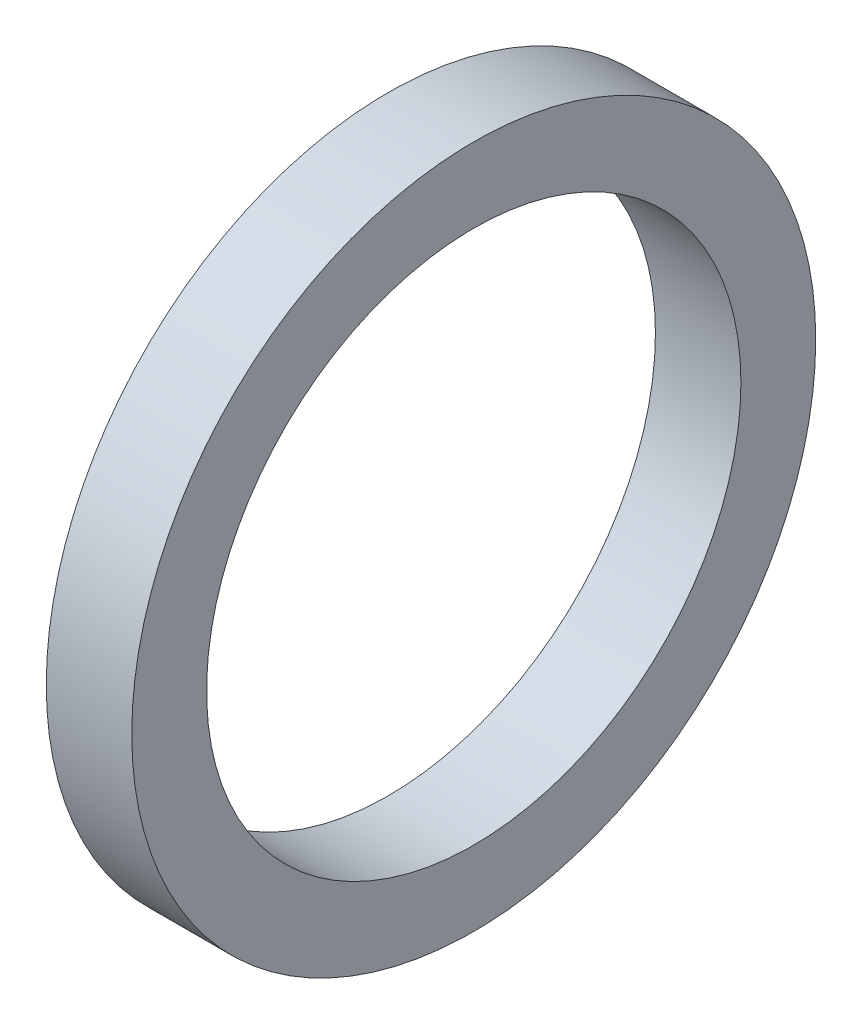
ISO-10303-21;
HEADER;
FILE_DESCRIPTION(('STEP AP214'),'2;1');
FILE_NAME('part.step','',(''),(''),'','','');
FILE_SCHEMA(('AUTOMOTIVE_DESIGN { 1 0 10303 214 1 1 1 1 }'));
ENDSEC;
DATA;
#1=APPLICATION_CONTEXT('core data for automotive mechanical design processes');
#2=APPLICATION_PROTOCOL_DEFINITION('international standard','automotive_design',2000,#1);
#3=PRODUCT_CONTEXT('',#1,'mechanical');
#4=PRODUCT('Part','Part','',(#3));
#5=PRODUCT_RELATED_PRODUCT_CATEGORY('part','',(#4));
#6=PRODUCT_DEFINITION_FORMATION('','',#4);
#7=PRODUCT_DEFINITION_CONTEXT('part definition',#1,'design');
#8=PRODUCT_DEFINITION('design','',#6,#7);
#9=PRODUCT_DEFINITION_SHAPE('','',#8);
#10=(LENGTH_UNIT() NAMED_UNIT(*) SI_UNIT(.MILLI.,.METRE.));
#11=(NAMED_UNIT(*) PLANE_ANGLE_UNIT() SI_UNIT($,.RADIAN.));
#12=(NAMED_UNIT(*) SI_UNIT($,.STERADIAN.) SOLID_ANGLE_UNIT());
#13=UNCERTAINTY_MEASURE_WITH_UNIT(LENGTH_MEASURE(1.E-05),#10,'distance_accuracy_value','');
#14=(GEOMETRIC_REPRESENTATION_CONTEXT(3) GLOBAL_UNCERTAINTY_ASSIGNED_CONTEXT((#13)) GLOBAL_UNIT_ASSIGNED_CONTEXT((#10,
#11,#12)) REPRESENTATION_CONTEXT('',''));
#15=CARTESIAN_POINT('',(0.,0.,0.));
#16=DIRECTION('',(0.,0.,1.));
#17=DIRECTION('',(1.,0.,0.));
#18=AXIS2_PLACEMENT_3D('',#15,#16,#17);
#19=CARTESIAN_POINT('',(4.,0.,0.));
#20=DIRECTION('',(1.,0.,0.));
#21=DIRECTION('',(0.,0.,-1.));
#22=AXIS2_PLACEMENT_3D('',#19,#20,#21);
#23=PLANE('',#22);
#24=CARTESIAN_POINT('',(4.,0.,0.));
#25=DIRECTION('',(1.,0.,0.));
#26=DIRECTION('',(0.,0.,-1.));
#27=AXIS2_PLACEMENT_3D('',#24,#25,#26);
#28=CIRCLE('',#27,16.);
#29=CARTESIAN_POINT('',(4.,0.,-16.));
#30=VERTEX_POINT('',#29);
#31=EDGE_CURVE('E10',#30,#30,#28,.T.);
#32=ORIENTED_EDGE('',*,*,#31,.T.);
#33=EDGE_LOOP('',(#32));
#34=FACE_BOUND('',#33,.T.);
#35=CARTESIAN_POINT('',(4.,0.,0.));
#36=DIRECTION('',(1.,0.,0.));
#37=DIRECTION('',(0.,0.,-1.));
#38=AXIS2_PLACEMENT_3D('',#35,#36,#37);
#39=CIRCLE('',#38,12.5);
#40=CARTESIAN_POINT('',(4.,0.,-12.5));
#41=VERTEX_POINT('',#40);
#42=EDGE_CURVE('E45',#41,#41,#39,.T.);
#43=ORIENTED_EDGE('',*,*,#42,.F.);
#44=EDGE_LOOP('',(#43));
#45=FACE_BOUND('',#44,.T.);
#46=ADVANCED_FACE('F34',(#34,#45),#23,.T.);
#47=CARTESIAN_POINT('',(0.,0.,0.));
#48=DIRECTION('',(1.,0.,0.));
#49=DIRECTION('',(0.,0.,-1.));
#50=AXIS2_PLACEMENT_3D('',#47,#48,#49);
#51=PLANE('',#50);
#52=CARTESIAN_POINT('',(0.,0.,0.));
#53=DIRECTION('',(1.,0.,0.));
#54=DIRECTION('',(0.,0.,-1.));
#55=AXIS2_PLACEMENT_3D('',#52,#53,#54);
#56=CIRCLE('',#55,16.);
#57=CARTESIAN_POINT('',(0.,0.,-16.));
#58=VERTEX_POINT('',#57);
#59=EDGE_CURVE('E38',#58,#58,#56,.T.);
#60=ORIENTED_EDGE('',*,*,#59,.F.);
#61=EDGE_LOOP('',(#60));
#62=FACE_BOUND('',#61,.T.);
#63=CARTESIAN_POINT('',(0.,0.,0.));
#64=DIRECTION('',(1.,0.,0.));
#65=DIRECTION('',(0.,0.,-1.));
#66=AXIS2_PLACEMENT_3D('',#63,#64,#65);
#67=CIRCLE('',#66,12.5);
#68=CARTESIAN_POINT('',(0.,0.,-12.5));
#69=VERTEX_POINT('',#68);
#70=EDGE_CURVE('E47',#69,#69,#67,.T.);
#71=ORIENTED_EDGE('',*,*,#70,.T.);
#72=EDGE_LOOP('',(#71));
#73=FACE_BOUND('',#72,.T.);
#74=ADVANCED_FACE('F57',(#62,#73),#51,.F.);
#75=CARTESIAN_POINT('',(4.,0.,0.));
#76=DIRECTION('',(-1.,0.,0.));
#77=DIRECTION('',(0.,0.,1.));
#78=AXIS2_PLACEMENT_3D('',#75,#76,#77);
#79=CYLINDRICAL_SURFACE('',#78,16.);
#80=ORIENTED_EDGE('',*,*,#31,.F.);
#81=EDGE_LOOP('',(#80));
#82=FACE_BOUND('',#81,.T.);
#83=ORIENTED_EDGE('',*,*,#59,.T.);
#84=EDGE_LOOP('',(#83));
#85=FACE_BOUND('',#84,.T.);
#86=ADVANCED_FACE('F36',(#82,#85),#79,.T.);
#87=CARTESIAN_POINT('',(4.,0.,0.));
#88=DIRECTION('',(-1.,0.,0.));
#89=DIRECTION('',(0.,0.,1.));
#90=AXIS2_PLACEMENT_3D('',#87,#88,#89);
#91=CYLINDRICAL_SURFACE('',#90,12.5);
#92=ORIENTED_EDGE('',*,*,#42,.T.);
#93=EDGE_LOOP('',(#92));
#94=FACE_BOUND('',#93,.T.);
#95=ORIENTED_EDGE('',*,*,#70,.F.);
#96=EDGE_LOOP('',(#95));
#97=FACE_BOUND('',#96,.T.);
#98=ADVANCED_FACE('F53',(#94,#97),#91,.F.);
#99=CLOSED_SHELL('',(#46,#74,#86,#98));
#100=MANIFOLD_SOLID_BREP('B2',#99);
#101=ADVANCED_BREP_SHAPE_REPRESENTATION('',(#18,#100),#14);
#102=SHAPE_DEFINITION_REPRESENTATION(#9,#101);
ENDSEC;
END-ISO-10303-21;
